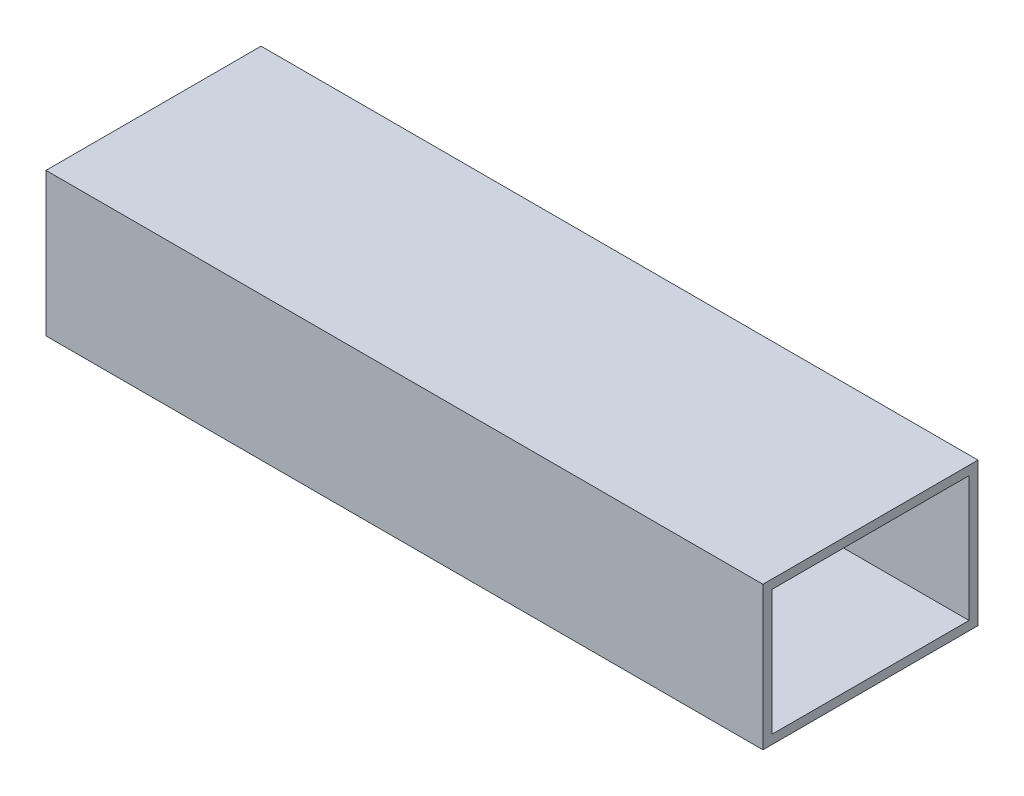
ISO-10303-21;
HEADER;
FILE_DESCRIPTION(('STEP AP214'),'2;1');
FILE_NAME('part.step','',(''),(''),'','','');
FILE_SCHEMA(('AUTOMOTIVE_DESIGN { 1 0 10303 214 1 1 1 1 }'));
ENDSEC;
DATA;
#1=APPLICATION_CONTEXT('core data for automotive mechanical design processes');
#2=APPLICATION_PROTOCOL_DEFINITION('international standard','automotive_design',2000,#1);
#3=PRODUCT_CONTEXT('',#1,'mechanical');
#4=PRODUCT('Part','Part','',(#3));
#5=PRODUCT_RELATED_PRODUCT_CATEGORY('part','',(#4));
#6=PRODUCT_DEFINITION_FORMATION('','',#4);
#7=PRODUCT_DEFINITION_CONTEXT('part definition',#1,'design');
#8=PRODUCT_DEFINITION('design','',#6,#7);
#9=PRODUCT_DEFINITION_SHAPE('','',#8);
#10=(LENGTH_UNIT() NAMED_UNIT(*) SI_UNIT(.MILLI.,.METRE.));
#11=(NAMED_UNIT(*) PLANE_ANGLE_UNIT() SI_UNIT($,.RADIAN.));
#12=(NAMED_UNIT(*) SI_UNIT($,.STERADIAN.) SOLID_ANGLE_UNIT());
#13=UNCERTAINTY_MEASURE_WITH_UNIT(LENGTH_MEASURE(1.E-05),#10,'distance_accuracy_value','');
#14=(GEOMETRIC_REPRESENTATION_CONTEXT(3) GLOBAL_UNCERTAINTY_ASSIGNED_CONTEXT((#13)) GLOBAL_UNIT_ASSIGNED_CONTEXT((#10,
#11,#12)) REPRESENTATION_CONTEXT('',''));
#15=CARTESIAN_POINT('',(0.,0.,0.));
#16=DIRECTION('',(0.,0.,1.));
#17=DIRECTION('',(1.,0.,0.));
#18=AXIS2_PLACEMENT_3D('',#15,#16,#17);
#19=CARTESIAN_POINT('',(254.,0.,0.));
#20=DIRECTION('',(-1.,0.,0.));
#21=DIRECTION('',(0.,0.,1.));
#22=AXIS2_PLACEMENT_3D('',#19,#20,#21);
#23=PLANE('',#22);
#24=DIRECTION('',(0.,1.,0.));
#25=VECTOR('',#24,1.);
#26=CARTESIAN_POINT('',(254.,-25.4,-38.1));
#27=LINE('',#26,#25);
#28=CARTESIAN_POINT('',(254.,-25.4,-38.1));
#29=VERTEX_POINT('',#28);
#30=CARTESIAN_POINT('',(254.,25.4,-38.1));
#31=VERTEX_POINT('',#30);
#32=EDGE_CURVE('E140',#29,#31,#27,.T.);
#33=ORIENTED_EDGE('',*,*,#32,.T.);
#34=DIRECTION('',(0.,0.,1.));
#35=VECTOR('',#34,1.);
#36=CARTESIAN_POINT('',(254.,25.4,38.1));
#37=LINE('',#36,#35);
#38=CARTESIAN_POINT('',(254.,25.4,38.1));
#39=VERTEX_POINT('',#38);
#40=EDGE_CURVE('E143',#31,#39,#37,.T.);
#41=ORIENTED_EDGE('',*,*,#40,.T.);
#42=DIRECTION('',(0.,-1.,0.));
#43=VECTOR('',#42,1.);
#44=CARTESIAN_POINT('',(254.,-25.4,38.1));
#45=LINE('',#44,#43);
#46=CARTESIAN_POINT('',(254.,-25.4,38.1));
#47=VERTEX_POINT('',#46);
#48=EDGE_CURVE('E146',#39,#47,#45,.T.);
#49=ORIENTED_EDGE('',*,*,#48,.T.);
#50=DIRECTION('',(0.,0.,-1.));
#51=VECTOR('',#50,1.);
#52=CARTESIAN_POINT('',(254.,-25.4,38.1));
#53=LINE('',#52,#51);
#54=EDGE_CURVE('E148',#47,#29,#53,.T.);
#55=ORIENTED_EDGE('',*,*,#54,.T.);
#56=EDGE_LOOP('',(#33,#41,#49,#55));
#57=FACE_BOUND('',#56,.T.);
#58=DIRECTION('',(0.,-1.,0.));
#59=VECTOR('',#58,1.);
#60=CARTESIAN_POINT('',(254.,-22.225,34.925));
#61=LINE('',#60,#59);
#62=CARTESIAN_POINT('',(254.,22.225,34.925));
#63=VERTEX_POINT('',#62);
#64=CARTESIAN_POINT('',(254.,-22.225,34.925));
#65=VERTEX_POINT('',#64);
#66=EDGE_CURVE('E104',#63,#65,#61,.T.);
#67=ORIENTED_EDGE('',*,*,#66,.F.);
#68=DIRECTION('',(0.,0.,1.));
#69=VECTOR('',#68,1.);
#70=CARTESIAN_POINT('',(254.,22.225,34.925));
#71=LINE('',#70,#69);
#72=CARTESIAN_POINT('',(254.,22.225,-34.925));
#73=VERTEX_POINT('',#72);
#74=EDGE_CURVE('E126',#73,#63,#71,.T.);
#75=ORIENTED_EDGE('',*,*,#74,.F.);
#76=DIRECTION('',(0.,1.,0.));
#77=VECTOR('',#76,1.);
#78=CARTESIAN_POINT('',(254.,-22.225,-34.925));
#79=LINE('',#78,#77);
#80=CARTESIAN_POINT('',(254.,-22.225,-34.925));
#81=VERTEX_POINT('',#80);
#82=EDGE_CURVE('E124',#81,#73,#79,.T.);
#83=ORIENTED_EDGE('',*,*,#82,.F.);
#84=DIRECTION('',(0.,0.,-1.));
#85=VECTOR('',#84,1.);
#86=CARTESIAN_POINT('',(254.,-22.225,34.925));
#87=LINE('',#86,#85);
#88=EDGE_CURVE('E112',#65,#81,#87,.T.);
#89=ORIENTED_EDGE('',*,*,#88,.F.);
#90=EDGE_LOOP('',(#67,#75,#83,#89));
#91=FACE_BOUND('',#90,.T.);
#92=ADVANCED_FACE('F39',(#57,#91),#23,.F.);
#93=CARTESIAN_POINT('',(0.,0.,0.));
#94=DIRECTION('',(-1.,0.,0.));
#95=DIRECTION('',(0.,0.,1.));
#96=AXIS2_PLACEMENT_3D('',#93,#94,#95);
#97=PLANE('',#96);
#98=DIRECTION('',(0.,1.,0.));
#99=VECTOR('',#98,1.);
#100=CARTESIAN_POINT('',(0.,-25.4,-38.1));
#101=LINE('',#100,#99);
#102=CARTESIAN_POINT('',(0.,-25.4,-38.1));
#103=VERTEX_POINT('',#102);
#104=CARTESIAN_POINT('',(0.,25.4,-38.1));
#105=VERTEX_POINT('',#104);
#106=EDGE_CURVE('E120',#103,#105,#101,.T.);
#107=ORIENTED_EDGE('',*,*,#106,.F.);
#108=DIRECTION('',(0.,0.,-1.));
#109=VECTOR('',#108,1.);
#110=CARTESIAN_POINT('',(0.,-25.4,38.1));
#111=LINE('',#110,#109);
#112=CARTESIAN_POINT('',(0.,-25.4,38.1));
#113=VERTEX_POINT('',#112);
#114=EDGE_CURVE('E144',#113,#103,#111,.T.);
#115=ORIENTED_EDGE('',*,*,#114,.F.);
#116=DIRECTION('',(0.,-1.,0.));
#117=VECTOR('',#116,1.);
#118=CARTESIAN_POINT('',(0.,-25.4,38.1));
#119=LINE('',#118,#117);
#120=CARTESIAN_POINT('',(0.,25.4,38.1));
#121=VERTEX_POINT('',#120);
#122=EDGE_CURVE('E155',#121,#113,#119,.T.);
#123=ORIENTED_EDGE('',*,*,#122,.F.);
#124=DIRECTION('',(0.,0.,1.));
#125=VECTOR('',#124,1.);
#126=CARTESIAN_POINT('',(0.,25.4,38.1));
#127=LINE('',#126,#125);
#128=EDGE_CURVE('E153',#105,#121,#127,.T.);
#129=ORIENTED_EDGE('',*,*,#128,.F.);
#130=EDGE_LOOP('',(#107,#115,#123,#129));
#131=FACE_BOUND('',#130,.T.);
#132=DIRECTION('',(0.,0.,1.));
#133=VECTOR('',#132,1.);
#134=CARTESIAN_POINT('',(0.,22.225,34.925));
#135=LINE('',#134,#133);
#136=CARTESIAN_POINT('',(0.,22.225,-34.925));
#137=VERTEX_POINT('',#136);
#138=CARTESIAN_POINT('',(0.,22.225,34.925));
#139=VERTEX_POINT('',#138);
#140=EDGE_CURVE('E113',#137,#139,#135,.T.);
#141=ORIENTED_EDGE('',*,*,#140,.T.);
#142=DIRECTION('',(0.,-1.,0.));
#143=VECTOR('',#142,1.);
#144=CARTESIAN_POINT('',(0.,-22.225,34.925));
#145=LINE('',#144,#143);
#146=CARTESIAN_POINT('',(0.,-22.225,34.925));
#147=VERTEX_POINT('',#146);
#148=EDGE_CURVE('E62',#139,#147,#145,.T.);
#149=ORIENTED_EDGE('',*,*,#148,.T.);
#150=DIRECTION('',(0.,0.,-1.));
#151=VECTOR('',#150,1.);
#152=CARTESIAN_POINT('',(0.,-22.225,34.925));
#153=LINE('',#152,#151);
#154=CARTESIAN_POINT('',(0.,-22.225,-34.925));
#155=VERTEX_POINT('',#154);
#156=EDGE_CURVE('E119',#147,#155,#153,.T.);
#157=ORIENTED_EDGE('',*,*,#156,.T.);
#158=DIRECTION('',(0.,1.,0.));
#159=VECTOR('',#158,1.);
#160=CARTESIAN_POINT('',(0.,-22.225,-34.925));
#161=LINE('',#160,#159);
#162=EDGE_CURVE('E132',#155,#137,#161,.T.);
#163=ORIENTED_EDGE('',*,*,#162,.T.);
#164=EDGE_LOOP('',(#141,#149,#157,#163));
#165=FACE_BOUND('',#164,.T.);
#166=ADVANCED_FACE('F173',(#131,#165),#97,.T.);
#167=CARTESIAN_POINT('',(254.,-25.4,-38.1));
#168=DIRECTION('',(0.,0.,1.));
#169=DIRECTION('',(1.,0.,0.));
#170=AXIS2_PLACEMENT_3D('',#167,#168,#169);
#171=PLANE('',#170);
#172=ORIENTED_EDGE('',*,*,#106,.T.);
#173=DIRECTION('',(-1.,0.,0.));
#174=VECTOR('',#173,1.);
#175=CARTESIAN_POINT('',(254.,25.4,-38.1));
#176=LINE('',#175,#174);
#177=EDGE_CURVE('E11',#31,#105,#176,.T.);
#178=ORIENTED_EDGE('',*,*,#177,.F.);
#179=ORIENTED_EDGE('',*,*,#32,.F.);
#180=DIRECTION('',(-1.,0.,0.));
#181=VECTOR('',#180,1.);
#182=CARTESIAN_POINT('',(254.,-25.4,-38.1));
#183=LINE('',#182,#181);
#184=EDGE_CURVE('E150',#29,#103,#183,.T.);
#185=ORIENTED_EDGE('',*,*,#184,.T.);
#186=EDGE_LOOP('',(#172,#178,#179,#185));
#187=FACE_BOUND('',#186,.T.);
#188=ADVANCED_FACE('F41',(#187),#171,.F.);
#189=CARTESIAN_POINT('',(254.,25.4,38.1));
#190=DIRECTION('',(0.,-1.,0.));
#191=DIRECTION('',(0.,0.,-1.));
#192=AXIS2_PLACEMENT_3D('',#189,#190,#191);
#193=PLANE('',#192);
#194=ORIENTED_EDGE('',*,*,#128,.T.);
#195=DIRECTION('',(-1.,0.,0.));
#196=VECTOR('',#195,1.);
#197=CARTESIAN_POINT('',(254.,25.4,38.1));
#198=LINE('',#197,#196);
#199=EDGE_CURVE('E47',#39,#121,#198,.T.);
#200=ORIENTED_EDGE('',*,*,#199,.F.);
#201=ORIENTED_EDGE('',*,*,#40,.F.);
#202=ORIENTED_EDGE('',*,*,#177,.T.);
#203=EDGE_LOOP('',(#194,#200,#201,#202));
#204=FACE_BOUND('',#203,.T.);
#205=ADVANCED_FACE('F183',(#204),#193,.F.);
#206=CARTESIAN_POINT('',(254.,-25.4,38.1));
#207=DIRECTION('',(0.,0.,-1.));
#208=DIRECTION('',(-1.,0.,0.));
#209=AXIS2_PLACEMENT_3D('',#206,#207,#208);
#210=PLANE('',#209);
#211=ORIENTED_EDGE('',*,*,#122,.T.);
#212=DIRECTION('',(-1.,0.,0.));
#213=VECTOR('',#212,1.);
#214=CARTESIAN_POINT('',(254.,-25.4,38.1));
#215=LINE('',#214,#213);
#216=EDGE_CURVE('E160',#47,#113,#215,.T.);
#217=ORIENTED_EDGE('',*,*,#216,.F.);
#218=ORIENTED_EDGE('',*,*,#48,.F.);
#219=ORIENTED_EDGE('',*,*,#199,.T.);
#220=EDGE_LOOP('',(#211,#217,#218,#219));
#221=FACE_BOUND('',#220,.T.);
#222=ADVANCED_FACE('F167',(#221),#210,.F.);
#223=CARTESIAN_POINT('',(254.,-25.4,38.1));
#224=DIRECTION('',(0.,1.,0.));
#225=DIRECTION('',(0.,0.,1.));
#226=AXIS2_PLACEMENT_3D('',#223,#224,#225);
#227=PLANE('',#226);
#228=ORIENTED_EDGE('',*,*,#114,.T.);
#229=ORIENTED_EDGE('',*,*,#184,.F.);
#230=ORIENTED_EDGE('',*,*,#54,.F.);
#231=ORIENTED_EDGE('',*,*,#216,.T.);
#232=EDGE_LOOP('',(#228,#229,#230,#231));
#233=FACE_BOUND('',#232,.T.);
#234=ADVANCED_FACE('F177',(#233),#227,.F.);
#235=CARTESIAN_POINT('',(254.,-22.225,34.925));
#236=DIRECTION('',(0.,0.,-1.));
#237=DIRECTION('',(-1.,0.,0.));
#238=AXIS2_PLACEMENT_3D('',#235,#236,#237);
#239=PLANE('',#238);
#240=ORIENTED_EDGE('',*,*,#148,.F.);
#241=DIRECTION('',(-1.,0.,0.));
#242=VECTOR('',#241,1.);
#243=CARTESIAN_POINT('',(254.,22.225,34.925));
#244=LINE('',#243,#242);
#245=EDGE_CURVE('E108',#63,#139,#244,.T.);
#246=ORIENTED_EDGE('',*,*,#245,.F.);
#247=ORIENTED_EDGE('',*,*,#66,.T.);
#248=DIRECTION('',(-1.,0.,0.));
#249=VECTOR('',#248,1.);
#250=CARTESIAN_POINT('',(254.,-22.225,34.925));
#251=LINE('',#250,#249);
#252=EDGE_CURVE('E107',#65,#147,#251,.T.);
#253=ORIENTED_EDGE('',*,*,#252,.T.);
#254=EDGE_LOOP('',(#240,#246,#247,#253));
#255=FACE_BOUND('',#254,.T.);
#256=ADVANCED_FACE('F106',(#255),#239,.T.);
#257=CARTESIAN_POINT('',(254.,-22.225,34.925));
#258=DIRECTION('',(0.,1.,0.));
#259=DIRECTION('',(0.,0.,1.));
#260=AXIS2_PLACEMENT_3D('',#257,#258,#259);
#261=PLANE('',#260);
#262=ORIENTED_EDGE('',*,*,#156,.F.);
#263=ORIENTED_EDGE('',*,*,#252,.F.);
#264=ORIENTED_EDGE('',*,*,#88,.T.);
#265=DIRECTION('',(-1.,0.,0.));
#266=VECTOR('',#265,1.);
#267=CARTESIAN_POINT('',(254.,-22.225,-34.925));
#268=LINE('',#267,#266);
#269=EDGE_CURVE('E121',#81,#155,#268,.T.);
#270=ORIENTED_EDGE('',*,*,#269,.T.);
#271=EDGE_LOOP('',(#262,#263,#264,#270));
#272=FACE_BOUND('',#271,.T.);
#273=ADVANCED_FACE('F116',(#272),#261,.T.);
#274=CARTESIAN_POINT('',(254.,-22.225,-34.925));
#275=DIRECTION('',(0.,0.,1.));
#276=DIRECTION('',(1.,0.,0.));
#277=AXIS2_PLACEMENT_3D('',#274,#275,#276);
#278=PLANE('',#277);
#279=ORIENTED_EDGE('',*,*,#162,.F.);
#280=ORIENTED_EDGE('',*,*,#269,.F.);
#281=ORIENTED_EDGE('',*,*,#82,.T.);
#282=DIRECTION('',(-1.,0.,0.));
#283=VECTOR('',#282,1.);
#284=CARTESIAN_POINT('',(254.,22.225,-34.925));
#285=LINE('',#284,#283);
#286=EDGE_CURVE('E54',#73,#137,#285,.T.);
#287=ORIENTED_EDGE('',*,*,#286,.T.);
#288=EDGE_LOOP('',(#279,#280,#281,#287));
#289=FACE_BOUND('',#288,.T.);
#290=ADVANCED_FACE('F206',(#289),#278,.T.);
#291=CARTESIAN_POINT('',(254.,22.225,34.925));
#292=DIRECTION('',(0.,-1.,0.));
#293=DIRECTION('',(0.,0.,-1.));
#294=AXIS2_PLACEMENT_3D('',#291,#292,#293);
#295=PLANE('',#294);
#296=ORIENTED_EDGE('',*,*,#140,.F.);
#297=ORIENTED_EDGE('',*,*,#286,.F.);
#298=ORIENTED_EDGE('',*,*,#74,.T.);
#299=ORIENTED_EDGE('',*,*,#245,.T.);
#300=EDGE_LOOP('',(#296,#297,#298,#299));
#301=FACE_BOUND('',#300,.T.);
#302=ADVANCED_FACE('F210',(#301),#295,.T.);
#303=CLOSED_SHELL('',(#92,#166,#188,#205,#222,#234,#256,#273,#290,#302));
#304=MANIFOLD_SOLID_BREP('B2',#303);
#305=ADVANCED_BREP_SHAPE_REPRESENTATION('',(#18,#304),#14);
#306=SHAPE_DEFINITION_REPRESENTATION(#9,#305);
ENDSEC;
END-ISO-10303-21;
